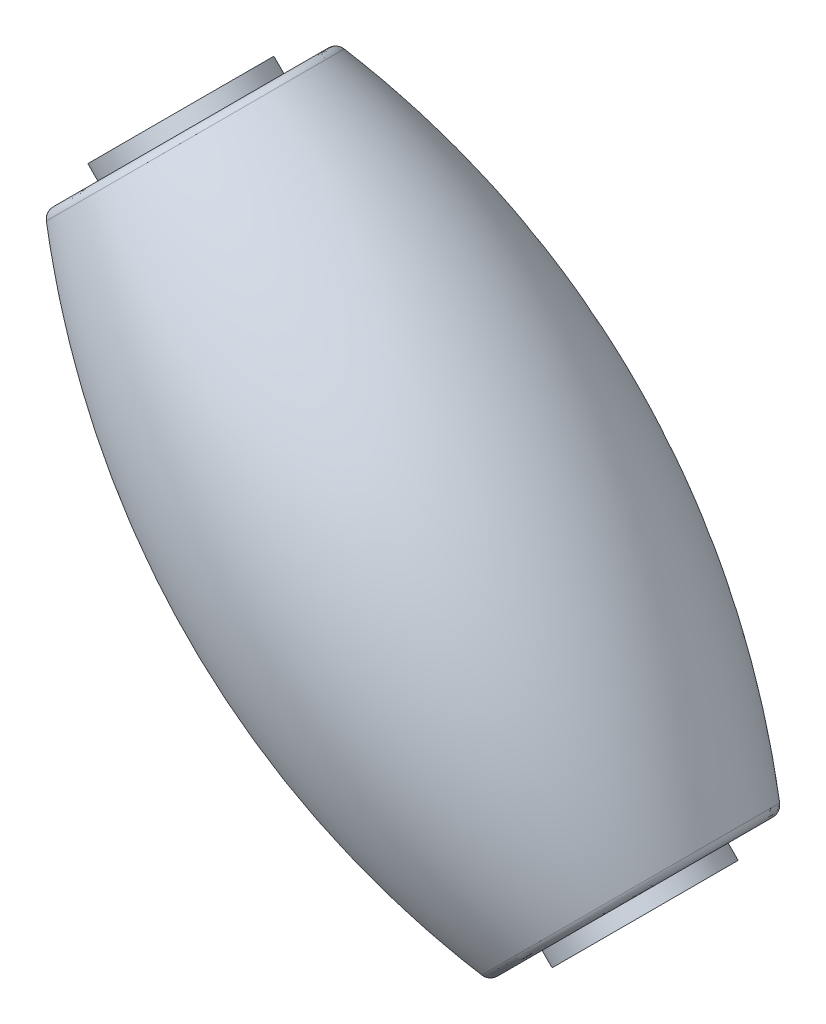
ISO-10303-21;
HEADER;
FILE_DESCRIPTION(('STEP AP214'),'2;1');
FILE_NAME('part.step','',(''),(''),'','','');
FILE_SCHEMA(('AUTOMOTIVE_DESIGN { 1 0 10303 214 1 1 1 1 }'));
ENDSEC;
DATA;
#1=APPLICATION_CONTEXT('core data for automotive mechanical design processes');
#2=APPLICATION_PROTOCOL_DEFINITION('international standard','automotive_design',2000,#1);
#3=PRODUCT_CONTEXT('',#1,'mechanical');
#4=PRODUCT('Part','Part','',(#3));
#5=PRODUCT_RELATED_PRODUCT_CATEGORY('part','',(#4));
#6=PRODUCT_DEFINITION_FORMATION('','',#4);
#7=PRODUCT_DEFINITION_CONTEXT('part definition',#1,'design');
#8=PRODUCT_DEFINITION('design','',#6,#7);
#9=PRODUCT_DEFINITION_SHAPE('','',#8);
#10=(LENGTH_UNIT() NAMED_UNIT(*) SI_UNIT(.MILLI.,.METRE.));
#11=(NAMED_UNIT(*) PLANE_ANGLE_UNIT() SI_UNIT($,.RADIAN.));
#12=(NAMED_UNIT(*) SI_UNIT($,.STERADIAN.) SOLID_ANGLE_UNIT());
#13=UNCERTAINTY_MEASURE_WITH_UNIT(LENGTH_MEASURE(1.E-05),#10,'distance_accuracy_value','');
#14=(GEOMETRIC_REPRESENTATION_CONTEXT(3) GLOBAL_UNCERTAINTY_ASSIGNED_CONTEXT((#13)) GLOBAL_UNIT_ASSIGNED_CONTEXT((#10,
#11,#12)) REPRESENTATION_CONTEXT('',''));
#15=CARTESIAN_POINT('',(0.,0.,0.));
#16=DIRECTION('',(0.,0.,1.));
#17=DIRECTION('',(1.,0.,0.));
#18=AXIS2_PLACEMENT_3D('',#15,#16,#17);
#19=CARTESIAN_POINT('',(47.0339011738895,8.64368677673921,0.));
#20=DIRECTION('',(-0.707106781186548,0.707106781186547,0.));
#21=DIRECTION('',(-0.707106781186547,-0.707106781186548,0.));
#22=AXIS2_PLACEMENT_3D('',#19,#20,#21);
#23=CYLINDRICAL_SURFACE('',#22,1.5875);
#24=CARTESIAN_POINT('',(13.2907790591823,42.3868088914464,0.));
#25=DIRECTION('',(-0.707106781186548,0.707106781186547,0.));
#26=DIRECTION('',(-0.707106781186547,-0.707106781186548,0.));
#27=AXIS2_PLACEMENT_3D('',#24,#25,#26);
#28=CIRCLE('',#27,1.5875);
#29=CARTESIAN_POINT('',(12.1682470440487,41.2642768763127,0.));
#30=VERTEX_POINT('',#29);
#31=EDGE_CURVE('E237',#30,#30,#28,.F.);
#32=ORIENTED_EDGE('',*,*,#31,.F.);
#33=EDGE_LOOP('',(#32));
#34=FACE_BOUND('',#33,.T.);
#35=CARTESIAN_POINT('',(42.3868088914464,13.2907790591823,0.));
#36=DIRECTION('',(-0.707106781186548,0.707106781186547,0.));
#37=DIRECTION('',(-0.707106781186547,-0.707106781186548,0.));
#38=AXIS2_PLACEMENT_3D('',#35,#36,#37);
#39=CIRCLE('',#38,1.5875);
#40=CARTESIAN_POINT('',(41.2642768763128,12.1682470440487,0.));
#41=VERTEX_POINT('',#40);
#42=EDGE_CURVE('E240',#41,#41,#39,.F.);
#43=ORIENTED_EDGE('',*,*,#42,.T.);
#44=EDGE_LOOP('',(#43));
#45=FACE_BOUND('',#44,.T.);
#46=ADVANCED_FACE('F17',(#34,#45),#23,.F.);
#47=CARTESIAN_POINT('',(42.3868088914464,13.2907790591823,0.));
#48=DIRECTION('',(-0.707106781186548,0.707106781186547,0.));
#49=DIRECTION('',(-0.707106781186547,-0.707106781186548,0.));
#50=AXIS2_PLACEMENT_3D('',#47,#48,#49);
#51=PLANE('',#50);
#52=ORIENTED_EDGE('',*,*,#42,.F.);
#53=EDGE_LOOP('',(#52));
#54=FACE_BOUND('',#53,.T.);
#55=CARTESIAN_POINT('',(42.3868088914464,13.2907790591823,0.));
#56=DIRECTION('',(-0.707106781186548,0.707106781186548,0.));
#57=DIRECTION('',(-0.707106781186548,-0.707106781186548,0.));
#58=AXIS2_PLACEMENT_3D('',#55,#56,#57);
#59=CIRCLE('',#58,4.7625);
#60=CARTESIAN_POINT('',(39.0192128460455,9.9231830137814,0.));
#61=VERTEX_POINT('',#60);
#62=EDGE_CURVE('E232',#61,#61,#59,.T.);
#63=ORIENTED_EDGE('',*,*,#62,.F.);
#64=EDGE_LOOP('',(#63));
#65=FACE_BOUND('',#64,.T.);
#66=ADVANCED_FACE('F136',(#54,#65),#51,.F.);
#67=CARTESIAN_POINT('',(13.2907790591823,42.3868088914464,0.));
#68=DIRECTION('',(-0.707106781186548,0.707106781186547,0.));
#69=DIRECTION('',(-0.707106781186547,-0.707106781186548,0.));
#70=AXIS2_PLACEMENT_3D('',#67,#68,#69);
#71=PLANE('',#70);
#72=ORIENTED_EDGE('',*,*,#31,.T.);
#73=EDGE_LOOP('',(#72));
#74=FACE_BOUND('',#73,.T.);
#75=CARTESIAN_POINT('',(13.2907790591823,42.3868088914464,0.));
#76=DIRECTION('',(-0.707106781186548,0.707106781186548,0.));
#77=DIRECTION('',(-0.707106781186548,-0.707106781186548,0.));
#78=AXIS2_PLACEMENT_3D('',#75,#76,#77);
#79=CIRCLE('',#78,4.7625);
#80=CARTESIAN_POINT('',(9.9231830137814,39.0192128460455,0.));
#81=VERTEX_POINT('',#80);
#82=EDGE_CURVE('E229',#81,#81,#79,.F.);
#83=ORIENTED_EDGE('',*,*,#82,.F.);
#84=EDGE_LOOP('',(#83));
#85=FACE_BOUND('',#84,.T.);
#86=ADVANCED_FACE('F133',(#74,#85),#71,.T.);
#87=CARTESIAN_POINT('',(52.5404268199212,3.13716113070749,0.));
#88=DIRECTION('',(-0.707106781186548,0.707106781186548,0.));
#89=DIRECTION('',(-0.707106781186548,-0.707106781186548,0.));
#90=AXIS2_PLACEMENT_3D('',#87,#88,#89);
#91=CYLINDRICAL_SURFACE('',#90,4.7625);
#92=CARTESIAN_POINT('',(41.7581909629716,13.9193969876572,0.));
#93=DIRECTION('',(-0.707106781186548,0.707106781186548,0.));
#94=DIRECTION('',(-0.707106781186548,-0.707106781186548,0.));
#95=AXIS2_PLACEMENT_3D('',#92,#93,#94);
#96=CIRCLE('',#95,4.7625);
#97=CARTESIAN_POINT('',(38.3905949175706,10.5518009422562,0.));
#98=VERTEX_POINT('',#97);
#99=EDGE_CURVE('E227',#98,#98,#96,.F.);
#100=ORIENTED_EDGE('',*,*,#99,.T.);
#101=EDGE_LOOP('',(#100));
#102=FACE_BOUND('',#101,.T.);
#103=ORIENTED_EDGE('',*,*,#62,.T.);
#104=EDGE_LOOP('',(#103));
#105=FACE_BOUND('',#104,.T.);
#106=ADVANCED_FACE('F129',(#102,#105),#91,.T.);
#107=CARTESIAN_POINT('',(52.5404268199212,3.13716113070749,0.));
#108=DIRECTION('',(-0.707106781186548,0.707106781186548,0.));
#109=DIRECTION('',(-0.707106781186548,-0.707106781186548,0.));
#110=AXIS2_PLACEMENT_3D('',#107,#108,#109);
#111=CYLINDRICAL_SURFACE('',#110,4.7625);
#112=CARTESIAN_POINT('',(13.9193969876572,41.7581909629716,0.));
#113=DIRECTION('',(-0.707106781186548,0.707106781186548,0.));
#114=DIRECTION('',(-0.707106781186548,-0.707106781186548,0.));
#115=AXIS2_PLACEMENT_3D('',#112,#113,#114);
#116=CIRCLE('',#115,4.7625);
#117=CARTESIAN_POINT('',(10.5518009422562,38.3905949175706,0.));
#118=VERTEX_POINT('',#117);
#119=EDGE_CURVE('E53',#118,#118,#116,.T.);
#120=ORIENTED_EDGE('',*,*,#119,.T.);
#121=EDGE_LOOP('',(#120));
#122=FACE_BOUND('',#121,.T.);
#123=ORIENTED_EDGE('',*,*,#82,.T.);
#124=EDGE_LOOP('',(#123));
#125=FACE_BOUND('',#124,.T.);
#126=ADVANCED_FACE('F125',(#122,#125),#111,.T.);
#127=CARTESIAN_POINT('',(41.7581909629716,13.9193969876572,0.));
#128=DIRECTION('',(-0.707106781186548,0.707106781186547,0.));
#129=DIRECTION('',(-0.707106781186547,-0.707106781186548,0.));
#130=AXIS2_PLACEMENT_3D('',#127,#128,#129);
#131=PLANE('',#130);
#132=CARTESIAN_POINT('',(41.7581909629716,13.9193969876572,0.));
#133=DIRECTION('',(-0.707106781186548,0.707106781186547,0.));
#134=DIRECTION('',(-0.707106781186548,-0.707106781186547,0.));
#135=AXIS2_PLACEMENT_3D('',#132,#133,#134);
#136=CIRCLE('',#135,7.03716243210739);
#137=CARTESIAN_POINT('',(36.7821656869172,8.94337171160283,0.));
#138=VERTEX_POINT('',#137);
#139=CARTESIAN_POINT('',(46.7342162390259,18.8954222637115,0.));
#140=VERTEX_POINT('',#139);
#141=EDGE_CURVE('E45',#138,#140,#136,.T.);
#142=ORIENTED_EDGE('',*,*,#141,.F.);
#143=CARTESIAN_POINT('',(41.7581909629716,13.9193969876572,0.));
#144=DIRECTION('',(-0.707106781186548,0.707106781186547,0.));
#145=DIRECTION('',(0.707106781186548,0.707106781186548,0.));
#146=AXIS2_PLACEMENT_3D('',#143,#144,#145);
#147=CIRCLE('',#146,7.03716243210739);
#148=EDGE_CURVE('E48',#140,#138,#147,.T.);
#149=ORIENTED_EDGE('',*,*,#148,.F.);
#150=EDGE_LOOP('',(#142,#149));
#151=FACE_BOUND('',#150,.T.);
#152=ORIENTED_EDGE('',*,*,#99,.F.);
#153=EDGE_LOOP('',(#152));
#154=FACE_BOUND('',#153,.T.);
#155=ADVANCED_FACE('F50',(#151,#154),#131,.F.);
#156=CARTESIAN_POINT('',(19.1951071985752,47.0339011738895,0.));
#157=DIRECTION('',(0.707106781186548,-0.707106781186547,0.));
#158=DIRECTION('',(0.707106781186547,0.707106781186548,0.));
#159=AXIS2_PLACEMENT_3D('',#156,#157,#158);
#160=PLANE('',#159);
#161=CARTESIAN_POINT('',(13.9193969876572,41.7581909629716,0.));
#162=DIRECTION('',(0.707106781186548,-0.707106781186547,0.));
#163=DIRECTION('',(0.707106781186548,0.707106781186548,0.));
#164=AXIS2_PLACEMENT_3D('',#161,#162,#163);
#165=CIRCLE('',#164,7.03716243210739);
#166=CARTESIAN_POINT('',(18.8954222637115,46.7342162390259,0.));
#167=VERTEX_POINT('',#166);
#168=CARTESIAN_POINT('',(8.94337171160284,36.7821656869172,0.));
#169=VERTEX_POINT('',#168);
#170=EDGE_CURVE('E58',#167,#169,#165,.T.);
#171=ORIENTED_EDGE('',*,*,#170,.F.);
#172=CARTESIAN_POINT('',(13.9193969876572,41.7581909629716,0.));
#173=DIRECTION('',(0.707106781186548,-0.707106781186547,0.));
#174=DIRECTION('',(-0.707106781186548,-0.707106781186548,0.));
#175=AXIS2_PLACEMENT_3D('',#172,#173,#174);
#176=CIRCLE('',#175,7.03716243210739);
#177=EDGE_CURVE('E36',#169,#167,#176,.T.);
#178=ORIENTED_EDGE('',*,*,#177,.F.);
#179=EDGE_LOOP('',(#171,#178));
#180=FACE_BOUND('',#179,.T.);
#181=ORIENTED_EDGE('',*,*,#119,.F.);
#182=EDGE_LOOP('',(#181));
#183=FACE_BOUND('',#182,.T.);
#184=ADVANCED_FACE('F78',(#180,#183),#160,.F.);
#185=CARTESIAN_POINT('',(41.3091781569181,14.3684097937106,0.));
#186=DIRECTION('',(-0.707106781186548,0.707106781186547,0.));
#187=DIRECTION('',(-0.707106781186547,-0.707106781186548,0.));
#188=AXIS2_PLACEMENT_3D('',#185,#186,#187);
#189=TOROIDAL_SURFACE('',#188,7.03716243210739,0.635);
#190=CARTESIAN_POINT('',(41.4796893490903,14.1978986015384,0.));
#191=DIRECTION('',(-0.707106781186548,0.707106781186547,0.));
#192=DIRECTION('',(-0.707106781186547,-0.707106781186548,0.));
#193=AXIS2_PLACEMENT_3D('',#190,#191,#192);
#194=CIRCLE('',#193,7.62459486795683);
#195=CARTESIAN_POINT('',(36.0882866141579,8.80649586660602,0.));
#196=VERTEX_POINT('',#195);
#197=EDGE_CURVE('E28',#196,#196,#194,.T.);
#198=ORIENTED_EDGE('',*,*,#197,.F.);
#199=EDGE_LOOP('',(#198));
#200=FACE_BOUND('',#199,.T.);
#201=ORIENTED_EDGE('',*,*,#141,.T.);
#202=ORIENTED_EDGE('',*,*,#148,.T.);
#203=EDGE_LOOP('',(#201,#202));
#204=FACE_BOUND('',#203,.T.);
#205=ADVANCED_FACE('F57',(#200,#204),#189,.T.);
#206=CARTESIAN_POINT('',(14.3684097937106,41.3091781569181,0.));
#207=DIRECTION('',(0.707106781186548,-0.707106781186547,0.));
#208=DIRECTION('',(0.707106781186547,0.707106781186547,0.));
#209=AXIS2_PLACEMENT_3D('',#206,#207,#208);
#210=TOROIDAL_SURFACE('',#209,7.0371624321074,0.635);
#211=CARTESIAN_POINT('',(14.1978986015385,41.4796893490903,0.));
#212=DIRECTION('',(-0.707106781186548,0.707106781186547,0.));
#213=DIRECTION('',(-0.707106781186547,-0.707106781186548,0.));
#214=AXIS2_PLACEMENT_3D('',#211,#212,#213);
#215=CIRCLE('',#214,7.62459486795686);
#216=CARTESIAN_POINT('',(8.80649586660601,36.0882866141579,0.));
#217=VERTEX_POINT('',#216);
#218=EDGE_CURVE('E11',#217,#217,#215,.F.);
#219=ORIENTED_EDGE('',*,*,#218,.F.);
#220=EDGE_LOOP('',(#219));
#221=FACE_BOUND('',#220,.T.);
#222=ORIENTED_EDGE('',*,*,#170,.T.);
#223=ORIENTED_EDGE('',*,*,#177,.T.);
#224=EDGE_LOOP('',(#222,#223));
#225=FACE_BOUND('',#224,.T.);
#226=ADVANCED_FACE('F77',(#221,#225),#210,.T.);
#227=CARTESIAN_POINT('',(55.6775879506287,55.6775879506288,0.));
#228=DIRECTION('',(0.,0.,1.));
#229=DIRECTION('',(-0.707106781186547,-0.707106781186548,0.));
#230=AXIS2_PLACEMENT_3D('',#227,#228,#229);
#231=CIRCLE('',#230,50.8);
#232=TRIMMED_CURVE('',#231,(PARAMETER_VALUE(-0.68408123179533)),
(PARAMETER_VALUE(0.684081231795329)),.T.,.PARAMETER.);
#233=CARTESIAN_POINT('',(27.8387939753144,27.8387939753144,0.));
#234=DIRECTION('',(-0.707106781186548,0.707106781186547,0.));
#235=AXIS1_PLACEMENT('',#233,#234);
#236=SURFACE_OF_REVOLUTION('',#232,#235);
#237=ORIENTED_EDGE('',*,*,#218,.T.);
#238=EDGE_LOOP('',(#237));
#239=FACE_BOUND('',#238,.T.);
#240=ORIENTED_EDGE('',*,*,#197,.T.);
#241=EDGE_LOOP('',(#240));
#242=FACE_BOUND('',#241,.T.);
#243=ADVANCED_FACE('F147',(#239,#242),#236,.F.);
#244=CLOSED_SHELL('',(#46,#66,#86,#106,#126,#155,#184,#205,#226,#243));
#245=MANIFOLD_SOLID_BREP('B1',#244);
#246=ADVANCED_BREP_SHAPE_REPRESENTATION('',(#18,#245),#14);
#247=SHAPE_DEFINITION_REPRESENTATION(#9,#246);
ENDSEC;
END-ISO-10303-21;
